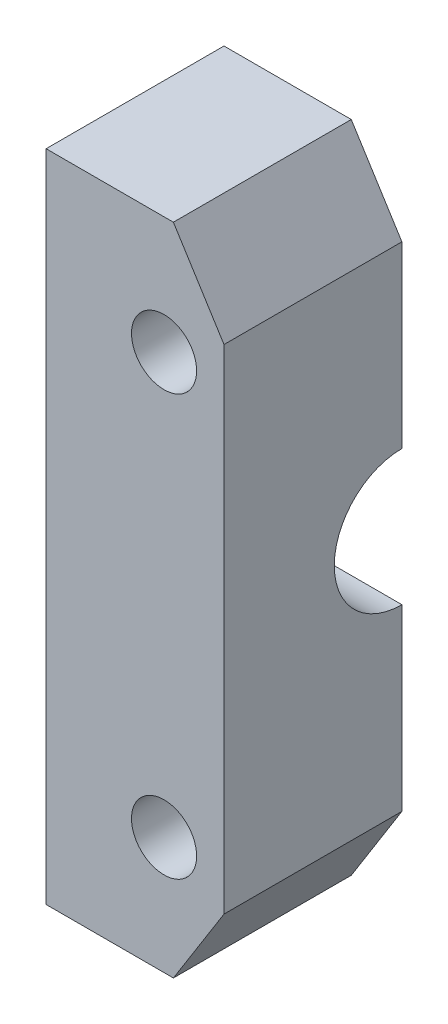
ISO-10303-21;
HEADER;
FILE_DESCRIPTION(('STEP AP214'),'2;1');
FILE_NAME('part.step','',(''),(''),'','','');
FILE_SCHEMA(('AUTOMOTIVE_DESIGN { 1 0 10303 214 1 1 1 1 }'));
ENDSEC;
DATA;
#1=APPLICATION_CONTEXT('core data for automotive mechanical design processes');
#2=APPLICATION_PROTOCOL_DEFINITION('international standard','automotive_design',2000,#1);
#3=PRODUCT_CONTEXT('',#1,'mechanical');
#4=PRODUCT('Part','Part','',(#3));
#5=PRODUCT_RELATED_PRODUCT_CATEGORY('part','',(#4));
#6=PRODUCT_DEFINITION_FORMATION('','',#4);
#7=PRODUCT_DEFINITION_CONTEXT('part definition',#1,'design');
#8=PRODUCT_DEFINITION('design','',#6,#7);
#9=PRODUCT_DEFINITION_SHAPE('','',#8);
#10=(LENGTH_UNIT() NAMED_UNIT(*) SI_UNIT(.MILLI.,.METRE.));
#11=(NAMED_UNIT(*) PLANE_ANGLE_UNIT() SI_UNIT($,.RADIAN.));
#12=(NAMED_UNIT(*) SI_UNIT($,.STERADIAN.) SOLID_ANGLE_UNIT());
#13=UNCERTAINTY_MEASURE_WITH_UNIT(LENGTH_MEASURE(1.E-05),#10,'distance_accuracy_value','');
#14=(GEOMETRIC_REPRESENTATION_CONTEXT(3) GLOBAL_UNCERTAINTY_ASSIGNED_CONTEXT((#13)) GLOBAL_UNIT_ASSIGNED_CONTEXT((#10,
#11,#12)) REPRESENTATION_CONTEXT('',''));
#15=CARTESIAN_POINT('',(0.,0.,0.));
#16=DIRECTION('',(0.,0.,1.));
#17=DIRECTION('',(1.,0.,0.));
#18=AXIS2_PLACEMENT_3D('',#15,#16,#17);
#19=CARTESIAN_POINT('',(75.538953295125,-47.4062995998032,12.7));
#20=DIRECTION('',(-0.847016896360737,0.531565967006376,0.));
#21=DIRECTION('',(-0.531565967006376,-0.847016896360737,0.));
#22=AXIS2_PLACEMENT_3D('',#19,#20,#21);
#23=PLANE('',#22);
#24=DIRECTION('',(0.531565967006376,0.847016896360737,0.));
#25=VECTOR('',#24,1.);
#26=CARTESIAN_POINT('',(75.538953295125,-47.4062995998032,0.));
#27=LINE('',#26,#25);
#28=CARTESIAN_POINT('',(90.6266479555727,-23.3650082122047,0.));
#29=VERTEX_POINT('',#28);
#30=CARTESIAN_POINT('',(94.239999992,-17.6073592705509,0.));
#31=VERTEX_POINT('',#30);
#32=EDGE_CURVE('E178',#29,#31,#27,.T.);
#33=ORIENTED_EDGE('',*,*,#32,.T.);
#34=DIRECTION('',(0.,0.,-1.));
#35=VECTOR('',#34,1.);
#36=CARTESIAN_POINT('',(94.239999992,-17.6073592705509,12.7));
#37=LINE('',#36,#35);
#38=CARTESIAN_POINT('',(94.239999992,-17.6073592705509,12.7));
#39=VERTEX_POINT('',#38);
#40=EDGE_CURVE('E215',#39,#31,#37,.T.);
#41=ORIENTED_EDGE('',*,*,#40,.F.);
#42=DIRECTION('',(0.531565967006376,0.847016896360737,0.));
#43=VECTOR('',#42,1.);
#44=CARTESIAN_POINT('',(75.538953295125,-47.4062995998032,12.7));
#45=LINE('',#44,#43);
#46=CARTESIAN_POINT('',(90.6266479555727,-23.3650082122047,12.7));
#47=VERTEX_POINT('',#46);
#48=EDGE_CURVE('E121',#47,#39,#45,.T.);
#49=ORIENTED_EDGE('',*,*,#48,.F.);
#50=DIRECTION('',(0.,0.,-1.));
#51=VECTOR('',#50,1.);
#52=CARTESIAN_POINT('',(90.6266479555727,-23.3650082122047,12.7));
#53=LINE('',#52,#51);
#54=EDGE_CURVE('E177',#47,#29,#53,.T.);
#55=ORIENTED_EDGE('',*,*,#54,.T.);
#56=EDGE_LOOP('',(#33,#41,#49,#55));
#57=FACE_BOUND('',#56,.T.);
#58=ADVANCED_FACE('F53',(#57),#23,.F.);
#59=CARTESIAN_POINT('',(94.239999992,0.,12.7));
#60=DIRECTION('',(1.,0.,0.));
#61=DIRECTION('',(0.,0.,-1.));
#62=AXIS2_PLACEMENT_3D('',#59,#60,#61);
#63=PLANE('',#62);
#64=CARTESIAN_POINT('',(94.239999992,0.,0.));
#65=DIRECTION('',(1.,0.,0.));
#66=DIRECTION('',(0.,0.,-1.));
#67=AXIS2_PLACEMENT_3D('',#64,#65,#66);
#68=CIRCLE('',#67,4.82599999999991);
#69=CARTESIAN_POINT('',(94.239999992,4.82599999999988,0.));
#70=VERTEX_POINT('',#69);
#71=CARTESIAN_POINT('',(94.239999992,-4.82599999999995,0.));
#72=VERTEX_POINT('',#71);
#73=EDGE_CURVE('E236',#70,#72,#68,.T.);
#74=ORIENTED_EDGE('',*,*,#73,.F.);
#75=DIRECTION('',(0.,-1.,0.));
#76=VECTOR('',#75,1.);
#77=CARTESIAN_POINT('',(94.239999992,0.,0.));
#78=LINE('',#77,#76);
#79=CARTESIAN_POINT('',(94.239999992,17.6073592705509,0.));
#80=VERTEX_POINT('',#79);
#81=EDGE_CURVE('E183',#80,#70,#78,.T.);
#82=ORIENTED_EDGE('',*,*,#81,.F.);
#83=DIRECTION('',(0.,0.,-1.));
#84=VECTOR('',#83,1.);
#85=CARTESIAN_POINT('',(94.239999992,17.6073592705509,12.7));
#86=LINE('',#85,#84);
#87=CARTESIAN_POINT('',(94.239999992,17.6073592705509,12.7));
#88=VERTEX_POINT('',#87);
#89=EDGE_CURVE('E212',#88,#80,#86,.T.);
#90=ORIENTED_EDGE('',*,*,#89,.F.);
#91=DIRECTION('',(0.,-1.,0.));
#92=VECTOR('',#91,1.);
#93=CARTESIAN_POINT('',(94.239999992,0.,12.7));
#94=LINE('',#93,#92);
#95=EDGE_CURVE('E163',#88,#39,#94,.T.);
#96=ORIENTED_EDGE('',*,*,#95,.T.);
#97=ORIENTED_EDGE('',*,*,#40,.T.);
#98=EDGE_CURVE('E182',#72,#31,#78,.T.);
#99=ORIENTED_EDGE('',*,*,#98,.F.);
#100=EDGE_LOOP('',(#74,#82,#90,#96,#97,#99));
#101=FACE_BOUND('',#100,.T.);
#102=ADVANCED_FACE('F241',(#101),#63,.T.);
#103=CARTESIAN_POINT('',(75.5389532951255,47.4062995998028,12.7));
#104=DIRECTION('',(-0.847016896360741,-0.53156596700637,0.));
#105=DIRECTION('',(0.53156596700637,-0.847016896360741,0.));
#106=AXIS2_PLACEMENT_3D('',#103,#104,#105);
#107=PLANE('',#106);
#108=DIRECTION('',(-0.53156596700637,0.847016896360741,0.));
#109=VECTOR('',#108,1.);
#110=CARTESIAN_POINT('',(75.5389532951255,47.4062995998028,0.));
#111=LINE('',#110,#109);
#112=CARTESIAN_POINT('',(90.6266479555727,23.3650082122047,0.));
#113=VERTEX_POINT('',#112);
#114=EDGE_CURVE('E187',#80,#113,#111,.T.);
#115=ORIENTED_EDGE('',*,*,#114,.T.);
#116=DIRECTION('',(0.,0.,-1.));
#117=VECTOR('',#116,1.);
#118=CARTESIAN_POINT('',(90.6266479555727,23.3650082122047,12.7));
#119=LINE('',#118,#117);
#120=CARTESIAN_POINT('',(90.6266479555727,23.3650082122047,12.7));
#121=VERTEX_POINT('',#120);
#122=EDGE_CURVE('E146',#121,#113,#119,.T.);
#123=ORIENTED_EDGE('',*,*,#122,.F.);
#124=DIRECTION('',(-0.53156596700637,0.847016896360741,0.));
#125=VECTOR('',#124,1.);
#126=CARTESIAN_POINT('',(75.5389532951255,47.4062995998028,12.7));
#127=LINE('',#126,#125);
#128=EDGE_CURVE('E157',#88,#121,#127,.T.);
#129=ORIENTED_EDGE('',*,*,#128,.F.);
#130=ORIENTED_EDGE('',*,*,#89,.T.);
#131=EDGE_LOOP('',(#115,#123,#129,#130));
#132=FACE_BOUND('',#131,.T.);
#133=ADVANCED_FACE('F250',(#132),#107,.F.);
#134=CARTESIAN_POINT('',(0.,23.3650082122047,12.7));
#135=DIRECTION('',(0.,1.,0.));
#136=DIRECTION('',(0.,0.,1.));
#137=AXIS2_PLACEMENT_3D('',#134,#135,#136);
#138=PLANE('',#137);
#139=DIRECTION('',(1.,0.,0.));
#140=VECTOR('',#139,1.);
#141=CARTESIAN_POINT('',(0.,23.3650082122047,0.));
#142=LINE('',#141,#140);
#143=CARTESIAN_POINT('',(81.539999992,23.3650082122047,0.));
#144=VERTEX_POINT('',#143);
#145=EDGE_CURVE('E142',#144,#113,#142,.T.);
#146=ORIENTED_EDGE('',*,*,#145,.F.);
#147=DIRECTION('',(0.,0.,-1.));
#148=VECTOR('',#147,1.);
#149=CARTESIAN_POINT('',(81.539999992,23.3650082122047,12.7));
#150=LINE('',#149,#148);
#151=CARTESIAN_POINT('',(81.539999992,23.3650082122047,12.7));
#152=VERTEX_POINT('',#151);
#153=EDGE_CURVE('E136',#152,#144,#150,.T.);
#154=ORIENTED_EDGE('',*,*,#153,.F.);
#155=DIRECTION('',(1.,0.,0.));
#156=VECTOR('',#155,1.);
#157=CARTESIAN_POINT('',(0.,23.3650082122047,12.7));
#158=LINE('',#157,#156);
#159=EDGE_CURVE('E140',#152,#121,#158,.T.);
#160=ORIENTED_EDGE('',*,*,#159,.T.);
#161=ORIENTED_EDGE('',*,*,#122,.T.);
#162=EDGE_LOOP('',(#146,#154,#160,#161));
#163=FACE_BOUND('',#162,.T.);
#164=ADVANCED_FACE('F138',(#163),#138,.T.);
#165=CARTESIAN_POINT('',(81.539999992,0.,12.7));
#166=DIRECTION('',(1.,0.,0.));
#167=DIRECTION('',(0.,0.,-1.));
#168=AXIS2_PLACEMENT_3D('',#165,#166,#167);
#169=PLANE('',#168);
#170=DIRECTION('',(0.,-1.,0.));
#171=VECTOR('',#170,1.);
#172=CARTESIAN_POINT('',(81.539999992,0.,0.));
#173=LINE('',#172,#171);
#174=CARTESIAN_POINT('',(81.539999992,-23.3650082122047,0.));
#175=VERTEX_POINT('',#174);
#176=EDGE_CURVE('E193',#144,#175,#173,.T.);
#177=ORIENTED_EDGE('',*,*,#176,.T.);
#178=DIRECTION('',(0.,0.,-1.));
#179=VECTOR('',#178,1.);
#180=CARTESIAN_POINT('',(81.539999992,-23.3650082122047,12.7));
#181=LINE('',#180,#179);
#182=CARTESIAN_POINT('',(81.539999992,-23.3650082122047,12.7));
#183=VERTEX_POINT('',#182);
#184=EDGE_CURVE('E147',#183,#175,#181,.T.);
#185=ORIENTED_EDGE('',*,*,#184,.F.);
#186=DIRECTION('',(0.,-1.,0.));
#187=VECTOR('',#186,1.);
#188=CARTESIAN_POINT('',(81.539999992,0.,12.7));
#189=LINE('',#188,#187);
#190=EDGE_CURVE('E150',#152,#183,#189,.T.);
#191=ORIENTED_EDGE('',*,*,#190,.F.);
#192=ORIENTED_EDGE('',*,*,#153,.T.);
#193=EDGE_LOOP('',(#177,#185,#191,#192));
#194=FACE_BOUND('',#193,.T.);
#195=ADVANCED_FACE('F151',(#194),#169,.F.);
#196=CARTESIAN_POINT('',(89.96,-15.,12.7));
#197=DIRECTION('',(0.,0.,-1.));
#198=DIRECTION('',(-1.,0.,0.));
#199=AXIS2_PLACEMENT_3D('',#196,#197,#198);
#200=CYLINDRICAL_SURFACE('',#199,2.32499999999999);
#201=CARTESIAN_POINT('',(89.96,-15.,12.7));
#202=DIRECTION('',(0.,0.,1.));
#203=DIRECTION('',(1.,0.,0.));
#204=AXIS2_PLACEMENT_3D('',#201,#202,#203);
#205=CIRCLE('',#204,2.32499999999999);
#206=CARTESIAN_POINT('',(92.285,-15.,12.7));
#207=VERTEX_POINT('',#206);
#208=EDGE_CURVE('E169',#207,#207,#205,.T.);
#209=ORIENTED_EDGE('',*,*,#208,.T.);
#210=EDGE_LOOP('',(#209));
#211=FACE_BOUND('',#210,.T.);
#212=CARTESIAN_POINT('',(89.96,-15.,0.));
#213=DIRECTION('',(0.,0.,1.));
#214=DIRECTION('',(1.,0.,0.));
#215=AXIS2_PLACEMENT_3D('',#212,#213,#214);
#216=CIRCLE('',#215,2.32499999999999);
#217=CARTESIAN_POINT('',(92.285,-15.,0.));
#218=VERTEX_POINT('',#217);
#219=EDGE_CURVE('E198',#218,#218,#216,.T.);
#220=ORIENTED_EDGE('',*,*,#219,.F.);
#221=EDGE_LOOP('',(#220));
#222=FACE_BOUND('',#221,.T.);
#223=ADVANCED_FACE('F269',(#211,#222),#200,.F.);
#224=CARTESIAN_POINT('',(0.,-23.3650082122046,12.7));
#225=DIRECTION('',(0.,1.,0.));
#226=DIRECTION('',(-1.,0.,0.));
#227=AXIS2_PLACEMENT_3D('',#224,#225,#226);
#228=PLANE('',#227);
#229=DIRECTION('',(1.,0.,0.));
#230=VECTOR('',#229,1.);
#231=CARTESIAN_POINT('',(0.,-23.3650082122046,0.));
#232=LINE('',#231,#230);
#233=EDGE_CURVE('E113',#175,#29,#232,.T.);
#234=ORIENTED_EDGE('',*,*,#233,.T.);
#235=ORIENTED_EDGE('',*,*,#54,.F.);
#236=DIRECTION('',(1.,0.,0.));
#237=VECTOR('',#236,1.);
#238=CARTESIAN_POINT('',(0.,-23.3650082122046,12.7));
#239=LINE('',#238,#237);
#240=EDGE_CURVE('E81',#183,#47,#239,.T.);
#241=ORIENTED_EDGE('',*,*,#240,.F.);
#242=ORIENTED_EDGE('',*,*,#184,.T.);
#243=EDGE_LOOP('',(#234,#235,#241,#242));
#244=FACE_BOUND('',#243,.T.);
#245=ADVANCED_FACE('F252',(#244),#228,.F.);
#246=CARTESIAN_POINT('',(89.96,15.,12.7));
#247=DIRECTION('',(0.,0.,-1.));
#248=DIRECTION('',(-1.,0.,0.));
#249=AXIS2_PLACEMENT_3D('',#246,#247,#248);
#250=CYLINDRICAL_SURFACE('',#249,2.32499999999999);
#251=CARTESIAN_POINT('',(89.96,15.,12.7));
#252=DIRECTION('',(0.,0.,1.));
#253=DIRECTION('',(1.,0.,0.));
#254=AXIS2_PLACEMENT_3D('',#251,#252,#253);
#255=CIRCLE('',#254,2.32499999999999);
#256=CARTESIAN_POINT('',(92.285,15.,12.7));
#257=VERTEX_POINT('',#256);
#258=EDGE_CURVE('E173',#257,#257,#255,.T.);
#259=ORIENTED_EDGE('',*,*,#258,.T.);
#260=EDGE_LOOP('',(#259));
#261=FACE_BOUND('',#260,.T.);
#262=CARTESIAN_POINT('',(89.96,15.,0.));
#263=DIRECTION('',(0.,0.,1.));
#264=DIRECTION('',(1.,0.,0.));
#265=AXIS2_PLACEMENT_3D('',#262,#263,#264);
#266=CIRCLE('',#265,2.32499999999999);
#267=CARTESIAN_POINT('',(92.285,15.,0.));
#268=VERTEX_POINT('',#267);
#269=EDGE_CURVE('E202',#268,#268,#266,.T.);
#270=ORIENTED_EDGE('',*,*,#269,.F.);
#271=EDGE_LOOP('',(#270));
#272=FACE_BOUND('',#271,.T.);
#273=ADVANCED_FACE('F272',(#261,#272),#250,.F.);
#274=CARTESIAN_POINT('',(0.,0.,12.7));
#275=DIRECTION('',(0.,0.,1.));
#276=DIRECTION('',(1.,0.,0.));
#277=AXIS2_PLACEMENT_3D('',#274,#275,#276);
#278=PLANE('',#277);
#279=ORIENTED_EDGE('',*,*,#48,.T.);
#280=ORIENTED_EDGE('',*,*,#95,.F.);
#281=ORIENTED_EDGE('',*,*,#128,.T.);
#282=ORIENTED_EDGE('',*,*,#159,.F.);
#283=ORIENTED_EDGE('',*,*,#190,.T.);
#284=ORIENTED_EDGE('',*,*,#240,.T.);
#285=EDGE_LOOP('',(#279,#280,#281,#282,#283,#284));
#286=FACE_BOUND('',#285,.T.);
#287=ORIENTED_EDGE('',*,*,#208,.F.);
#288=EDGE_LOOP('',(#287));
#289=FACE_BOUND('',#288,.T.);
#290=ORIENTED_EDGE('',*,*,#258,.F.);
#291=EDGE_LOOP('',(#290));
#292=FACE_BOUND('',#291,.T.);
#293=ADVANCED_FACE('F154',(#286,#289,#292),#278,.T.);
#294=CARTESIAN_POINT('',(0.,0.,0.));
#295=DIRECTION('',(0.,0.,1.));
#296=DIRECTION('',(1.,0.,0.));
#297=AXIS2_PLACEMENT_3D('',#294,#295,#296);
#298=PLANE('',#297);
#299=DIRECTION('',(0.,1.,0.));
#300=VECTOR('',#299,1.);
#301=CARTESIAN_POINT('',(86.239999992,0.,0.));
#302=LINE('',#301,#300);
#303=CARTESIAN_POINT('',(86.239999992,-4.82599999999995,0.));
#304=VERTEX_POINT('',#303);
#305=CARTESIAN_POINT('',(86.239999992,4.82599999999988,0.));
#306=VERTEX_POINT('',#305);
#307=EDGE_CURVE('E219',#304,#306,#302,.T.);
#308=ORIENTED_EDGE('',*,*,#307,.F.);
#309=DIRECTION('',(1.,0.,0.));
#310=VECTOR('',#309,1.);
#311=CARTESIAN_POINT('',(86.239999992,-4.82599999999995,0.));
#312=LINE('',#311,#310);
#313=EDGE_CURVE('E11',#304,#72,#312,.T.);
#314=ORIENTED_EDGE('',*,*,#313,.T.);
#315=ORIENTED_EDGE('',*,*,#98,.T.);
#316=ORIENTED_EDGE('',*,*,#32,.F.);
#317=ORIENTED_EDGE('',*,*,#233,.F.);
#318=ORIENTED_EDGE('',*,*,#176,.F.);
#319=ORIENTED_EDGE('',*,*,#145,.T.);
#320=ORIENTED_EDGE('',*,*,#114,.F.);
#321=ORIENTED_EDGE('',*,*,#81,.T.);
#322=DIRECTION('',(1.,0.,0.));
#323=VECTOR('',#322,1.);
#324=CARTESIAN_POINT('',(86.239999992,4.82599999999988,0.));
#325=LINE('',#324,#323);
#326=EDGE_CURVE('E61',#70,#306,#325,.F.);
#327=ORIENTED_EDGE('',*,*,#326,.T.);
#328=EDGE_LOOP('',(#308,#314,#315,#316,#317,#318,#319,#320,#321,#327));
#329=FACE_BOUND('',#328,.T.);
#330=ORIENTED_EDGE('',*,*,#219,.T.);
#331=EDGE_LOOP('',(#330));
#332=FACE_BOUND('',#331,.T.);
#333=ORIENTED_EDGE('',*,*,#269,.T.);
#334=EDGE_LOOP('',(#333));
#335=FACE_BOUND('',#334,.T.);
#336=ADVANCED_FACE('F226',(#329,#332,#335),#298,.F.);
#337=CARTESIAN_POINT('',(86.239999992,0.,0.));
#338=DIRECTION('',(1.,0.,0.));
#339=DIRECTION('',(0.,0.,-1.));
#340=AXIS2_PLACEMENT_3D('',#337,#338,#339);
#341=CYLINDRICAL_SURFACE('',#340,4.82599999999991);
#342=CARTESIAN_POINT('',(86.239999992,0.,0.));
#343=DIRECTION('',(1.,0.,0.));
#344=DIRECTION('',(0.,0.,-1.));
#345=AXIS2_PLACEMENT_3D('',#342,#343,#344);
#346=CIRCLE('',#345,4.82599999999991);
#347=EDGE_CURVE('E70',#306,#304,#346,.T.);
#348=ORIENTED_EDGE('',*,*,#347,.F.);
#349=ORIENTED_EDGE('',*,*,#326,.F.);
#350=ORIENTED_EDGE('',*,*,#73,.T.);
#351=ORIENTED_EDGE('',*,*,#313,.F.);
#352=EDGE_LOOP('',(#348,#349,#350,#351));
#353=FACE_BOUND('',#352,.T.);
#354=ADVANCED_FACE('F235',(#353),#341,.F.);
#355=CARTESIAN_POINT('',(86.239999992,0.,0.));
#356=DIRECTION('',(1.,0.,0.));
#357=DIRECTION('',(0.,0.,-1.));
#358=AXIS2_PLACEMENT_3D('',#355,#356,#357);
#359=PLANE('',#358);
#360=ORIENTED_EDGE('',*,*,#307,.T.);
#361=ORIENTED_EDGE('',*,*,#347,.T.);
#362=EDGE_LOOP('',(#360,#361));
#363=FACE_BOUND('',#362,.T.);
#364=ADVANCED_FACE('F285',(#363),#359,.T.);
#365=CLOSED_SHELL('',(#58,#102,#133,#164,#195,#223,#245,#273,#293,#336,#354,#364));
#366=MANIFOLD_SOLID_BREP('B2',#365);
#367=ADVANCED_BREP_SHAPE_REPRESENTATION('',(#18,#366),#14);
#368=SHAPE_DEFINITION_REPRESENTATION(#9,#367);
ENDSEC;
END-ISO-10303-21;
